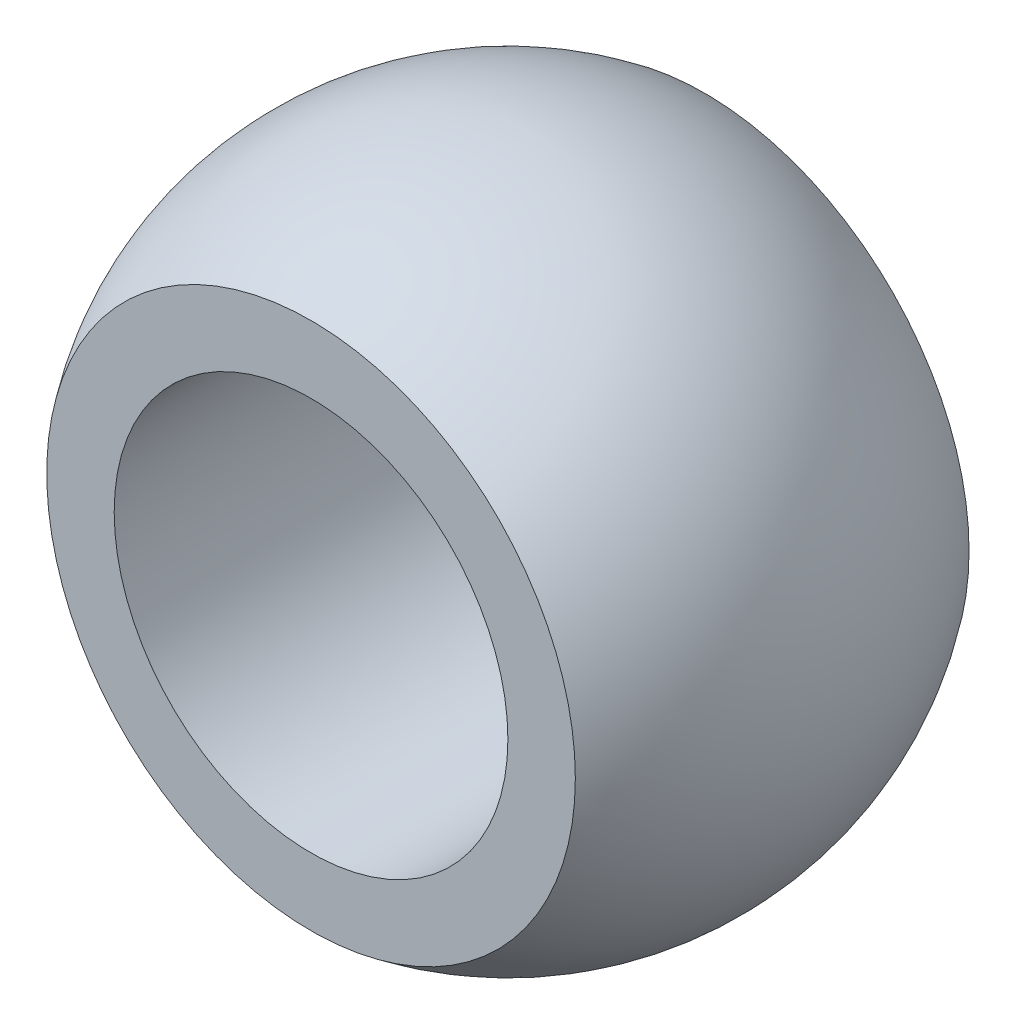
ISO-10303-21;
HEADER;
FILE_DESCRIPTION(('STEP AP214'),'2;1');
FILE_NAME('part.step','',(''),(''),'','','');
FILE_SCHEMA(('AUTOMOTIVE_DESIGN { 1 0 10303 214 1 1 1 1 }'));
ENDSEC;
DATA;
#1=APPLICATION_CONTEXT('core data for automotive mechanical design processes');
#2=APPLICATION_PROTOCOL_DEFINITION('international standard','automotive_design',2000,#1);
#3=PRODUCT_CONTEXT('',#1,'mechanical');
#4=PRODUCT('Part','Part','',(#3));
#5=PRODUCT_RELATED_PRODUCT_CATEGORY('part','',(#4));
#6=PRODUCT_DEFINITION_FORMATION('','',#4);
#7=PRODUCT_DEFINITION_CONTEXT('part definition',#1,'design');
#8=PRODUCT_DEFINITION('design','',#6,#7);
#9=PRODUCT_DEFINITION_SHAPE('','',#8);
#10=(LENGTH_UNIT() NAMED_UNIT(*) SI_UNIT(.MILLI.,.METRE.));
#11=(NAMED_UNIT(*) PLANE_ANGLE_UNIT() SI_UNIT($,.RADIAN.));
#12=(NAMED_UNIT(*) SI_UNIT($,.STERADIAN.) SOLID_ANGLE_UNIT());
#13=UNCERTAINTY_MEASURE_WITH_UNIT(LENGTH_MEASURE(1.E-05),#10,'distance_accuracy_value','');
#14=(GEOMETRIC_REPRESENTATION_CONTEXT(3) GLOBAL_UNCERTAINTY_ASSIGNED_CONTEXT((#13)) GLOBAL_UNIT_ASSIGNED_CONTEXT((#10,
#11,#12)) REPRESENTATION_CONTEXT('',''));
#15=CARTESIAN_POINT('',(0.,0.,0.));
#16=DIRECTION('',(0.,0.,1.));
#17=DIRECTION('',(1.,0.,0.));
#18=AXIS2_PLACEMENT_3D('',#15,#16,#17);
#19=CARTESIAN_POINT('',(0.,0.,0.));
#20=DIRECTION('',(0.,1.,0.));
#21=DIRECTION('',(-1.,0.,0.));
#22=AXIS2_PLACEMENT_3D('',#19,#20,#21);
#23=SPHERICAL_SURFACE('',#22,2.38125);
#24=CARTESIAN_POINT('',(0.,0.,0.));
#25=DIRECTION('',(0.,0.,1.));
#26=DIRECTION('',(1.,0.,0.));
#27=AXIS2_PLACEMENT_3D('',#24,#25,#26);
#28=SPHERICAL_SURFACE('',#27,2.38125);
#29=CARTESIAN_POINT('',(0.,0.,-1.4224));
#30=DIRECTION('',(0.,0.,1.));
#31=DIRECTION('',(1.,0.,0.));
#32=AXIS2_PLACEMENT_3D('',#29,#30,#31);
#33=CIRCLE('',#32,1.90974600470848);
#34=CARTESIAN_POINT('',(1.90974600470848,0.,-1.4224));
#35=VERTEX_POINT('',#34);
#36=EDGE_CURVE('E11',#35,#35,#33,.T.);
#37=ORIENTED_EDGE('',*,*,#36,.T.);
#38=EDGE_LOOP('',(#37));
#39=FACE_BOUND('',#38,.T.);
#40=CARTESIAN_POINT('',(0.,0.,1.4224));
#41=DIRECTION('',(0.,0.,1.));
#42=DIRECTION('',(1.,0.,0.));
#43=AXIS2_PLACEMENT_3D('',#40,#41,#42);
#44=CIRCLE('',#43,1.90974600470848);
#45=CARTESIAN_POINT('',(1.90974600470848,0.,1.4224));
#46=VERTEX_POINT('',#45);
#47=EDGE_CURVE('E42',#46,#46,#44,.T.);
#48=ORIENTED_EDGE('',*,*,#47,.F.);
#49=EDGE_LOOP('',(#48));
#50=FACE_BOUND('',#49,.T.);
#51=ADVANCED_FACE('F32',(#39,#50),#28,.T.);
#52=CARTESIAN_POINT('',(0.,0.,2.38125));
#53=DIRECTION('',(0.,0.,-1.));
#54=DIRECTION('',(-1.,0.,0.));
#55=AXIS2_PLACEMENT_3D('',#52,#53,#54);
#56=CYLINDRICAL_SURFACE('',#55,1.4224);
#57=CARTESIAN_POINT('',(0.,0.,-1.4224));
#58=DIRECTION('',(0.,0.,1.));
#59=DIRECTION('',(1.,0.,0.));
#60=AXIS2_PLACEMENT_3D('',#57,#58,#59);
#61=CIRCLE('',#60,1.4224);
#62=CARTESIAN_POINT('',(-1.4224,0.,-1.4224));
#63=VERTEX_POINT('',#62);
#64=EDGE_CURVE('E38',#63,#63,#61,.T.);
#65=CARTESIAN_POINT('',(0.,0.,1.4224));
#66=DIRECTION('',(0.,0.,1.));
#67=DIRECTION('',(1.,0.,0.));
#68=AXIS2_PLACEMENT_3D('',#65,#66,#67);
#69=CIRCLE('',#68,1.4224);
#70=CARTESIAN_POINT('',(-1.4224,0.,1.4224));
#71=VERTEX_POINT('',#70);
#72=EDGE_CURVE('E46',#71,#71,#69,.T.);
#73=CARTESIAN_POINT('',(-1.4224,0.,-1.4224));
#74=CARTESIAN_POINT('',(-1.4224,0.,-1.39276666666667));
#75=CARTESIAN_POINT('',(-1.4224,0.,-1.36313333333333));
#76=CARTESIAN_POINT('',(-1.4224,0.,-1.30386666666667));
#77=CARTESIAN_POINT('',(-1.4224,0.,-1.27423333333333));
#78=CARTESIAN_POINT('',(-1.4224,0.,-1.21496666666667));
#79=CARTESIAN_POINT('',(-1.4224,0.,-1.18533333333333));
#80=CARTESIAN_POINT('',(-1.4224,0.,-1.12606666666667));
#81=CARTESIAN_POINT('',(-1.4224,0.,-1.09643333333333));
#82=CARTESIAN_POINT('',(-1.4224,0.,-1.03716666666667));
#83=CARTESIAN_POINT('',(-1.4224,0.,-1.00753333333333));
#84=CARTESIAN_POINT('',(-1.4224,0.,-0.948266666666667));
#85=CARTESIAN_POINT('',(-1.4224,0.,-0.918633333333333));
#86=CARTESIAN_POINT('',(-1.4224,0.,-0.859366666666667));
#87=CARTESIAN_POINT('',(-1.4224,0.,-0.829733333333333));
#88=CARTESIAN_POINT('',(-1.4224,0.,-0.770466666666666));
#89=CARTESIAN_POINT('',(-1.4224,0.,-0.740833333333333));
#90=CARTESIAN_POINT('',(-1.4224,0.,-0.681566666666667));
#91=CARTESIAN_POINT('',(-1.4224,0.,-0.651933333333333));
#92=CARTESIAN_POINT('',(-1.4224,0.,-0.592666666666666));
#93=CARTESIAN_POINT('',(-1.4224,0.,-0.563033333333333));
#94=CARTESIAN_POINT('',(-1.4224,0.,-0.503766666666666));
#95=CARTESIAN_POINT('',(-1.4224,0.,-0.474133333333333));
#96=CARTESIAN_POINT('',(-1.4224,0.,-0.414866666666666));
#97=CARTESIAN_POINT('',(-1.4224,0.,-0.385233333333333));
#98=CARTESIAN_POINT('',(-1.4224,0.,-0.325966666666667));
#99=CARTESIAN_POINT('',(-1.4224,0.,-0.296333333333333));
#100=CARTESIAN_POINT('',(-1.4224,0.,-0.237066666666667));
#101=CARTESIAN_POINT('',(-1.4224,0.,-0.207433333333333));
#102=CARTESIAN_POINT('',(-1.4224,0.,-0.148166666666666));
#103=CARTESIAN_POINT('',(-1.4224,0.,-0.118533333333333));
#104=CARTESIAN_POINT('',(-1.4224,0.,-0.0592666666666666));
#105=CARTESIAN_POINT('',(-1.4224,0.,-0.0296333333333333));
#106=CARTESIAN_POINT('',(-1.4224,0.,0.0296333333333334));
#107=CARTESIAN_POINT('',(-1.4224,0.,0.0592666666666668));
#108=CARTESIAN_POINT('',(-1.4224,0.,0.118533333333334));
#109=CARTESIAN_POINT('',(-1.4224,0.,0.148166666666667));
#110=CARTESIAN_POINT('',(-1.4224,0.,0.207433333333334));
#111=CARTESIAN_POINT('',(-1.4224,0.,0.237066666666667));
#112=CARTESIAN_POINT('',(-1.4224,0.,0.296333333333333));
#113=CARTESIAN_POINT('',(-1.4224,0.,0.325966666666667));
#114=CARTESIAN_POINT('',(-1.4224,0.,0.385233333333333));
#115=CARTESIAN_POINT('',(-1.4224,0.,0.414866666666667));
#116=CARTESIAN_POINT('',(-1.4224,0.,0.474133333333333));
#117=CARTESIAN_POINT('',(-1.4224,0.,0.503766666666667));
#118=CARTESIAN_POINT('',(-1.4224,0.,0.563033333333333));
#119=CARTESIAN_POINT('',(-1.4224,0.,0.592666666666667));
#120=CARTESIAN_POINT('',(-1.4224,0.,0.651933333333333));
#121=CARTESIAN_POINT('',(-1.4224,0.,0.681566666666667));
#122=CARTESIAN_POINT('',(-1.4224,0.,0.740833333333333));
#123=CARTESIAN_POINT('',(-1.4224,0.,0.770466666666667));
#124=CARTESIAN_POINT('',(-1.4224,0.,0.829733333333333));
#125=CARTESIAN_POINT('',(-1.4224,0.,0.859366666666667));
#126=CARTESIAN_POINT('',(-1.4224,0.,0.918633333333334));
#127=CARTESIAN_POINT('',(-1.4224,0.,0.948266666666667));
#128=CARTESIAN_POINT('',(-1.4224,0.,1.00753333333333));
#129=CARTESIAN_POINT('',(-1.4224,0.,1.03716666666667));
#130=CARTESIAN_POINT('',(-1.4224,0.,1.09643333333333));
#131=CARTESIAN_POINT('',(-1.4224,0.,1.12606666666667));
#132=CARTESIAN_POINT('',(-1.4224,0.,1.18533333333333));
#133=CARTESIAN_POINT('',(-1.4224,0.,1.21496666666667));
#134=CARTESIAN_POINT('',(-1.4224,0.,1.27423333333333));
#135=CARTESIAN_POINT('',(-1.4224,0.,1.30386666666667));
#136=CARTESIAN_POINT('',(-1.4224,0.,1.36313333333333));
#137=CARTESIAN_POINT('',(-1.4224,0.,1.39276666666667));
#138=CARTESIAN_POINT('',(-1.4224,0.,1.4224));
#139=B_SPLINE_CURVE_WITH_KNOTS('',3,(#73,#74,#75,#76,#77,#78,#79,#80,#81,#82,#83,#84,#85,#86,
#87,#88,#89,#90,#91,#92,#93,#94,#95,#96,#97,#98,#99,#100,#101,#102,#103,#104,#105,#106,#107,
#108,#109,#110,#111,#112,#113,#114,#115,#116,#117,#118,#119,#120,#121,#122,#123,#124,#125,#126,
#127,#128,#129,#130,#131,#132,#133,#134,#135,#136,#137,#138),.UNSPECIFIED.,.F.,.F.,(4,2,2,2,2,2,
2,2,2,2,2,2,2,2,2,2,2,2,2,2,2,2,2,2,2,2,2,2,2,2,2,2,4),(0.,0.0888999999999998,0.1778,0.2667,
0.3556,0.4445,0.5334,0.6223,0.7112,0.8001,0.889,0.9779,1.0668,1.1557,1.2446,1.3335,1.4224,
1.5113,1.6002,1.6891,1.778,1.8669,1.9558,2.0447,2.1336,2.2225,2.3114,2.4003,2.4892,2.5781,2.667,
2.7559,2.8448),.UNSPECIFIED.);
#140=EDGE_CURVE('BSEAM52',#63,#71,#139,.T.);
#141=ORIENTED_EDGE('',*,*,#64,.F.);
#142=ORIENTED_EDGE('',*,*,#72,.T.);
#143=ORIENTED_EDGE('',*,*,#140,.T.);
#144=ORIENTED_EDGE('',*,*,#140,.F.);
#145=EDGE_LOOP('',(#141,#143,#142,#144));
#146=FACE_BOUND('',#145,.T.);
#147=ADVANCED_FACE('F52',(#146),#56,.F.);
#148=CARTESIAN_POINT('',(0.,0.,-1.4224));
#149=DIRECTION('',(0.,0.,1.));
#150=DIRECTION('',(1.,0.,0.));
#151=AXIS2_PLACEMENT_3D('',#148,#149,#150);
#152=PLANE('',#151);
#153=ORIENTED_EDGE('',*,*,#64,.T.);
#154=EDGE_LOOP('',(#153));
#155=FACE_BOUND('',#154,.T.);
#156=ORIENTED_EDGE('',*,*,#36,.F.);
#157=EDGE_LOOP('',(#156));
#158=FACE_BOUND('',#157,.T.);
#159=ADVANCED_FACE('F57',(#155,#158),#152,.F.);
#160=CARTESIAN_POINT('',(0.,0.,1.4224));
#161=DIRECTION('',(0.,0.,1.));
#162=DIRECTION('',(1.,0.,0.));
#163=AXIS2_PLACEMENT_3D('',#160,#161,#162);
#164=PLANE('',#163);
#165=ORIENTED_EDGE('',*,*,#72,.F.);
#166=EDGE_LOOP('',(#165));
#167=FACE_BOUND('',#166,.T.);
#168=ORIENTED_EDGE('',*,*,#47,.T.);
#169=EDGE_LOOP('',(#168));
#170=FACE_BOUND('',#169,.T.);
#171=ADVANCED_FACE('F54',(#167,#170),#164,.T.);
#172=CLOSED_SHELL('',(#51,#147,#159,#171));
#173=MANIFOLD_SOLID_BREP('B2',#172);
#174=ADVANCED_BREP_SHAPE_REPRESENTATION('',(#18,#173),#14);
#175=SHAPE_DEFINITION_REPRESENTATION(#9,#174);
ENDSEC;
END-ISO-10303-21;
